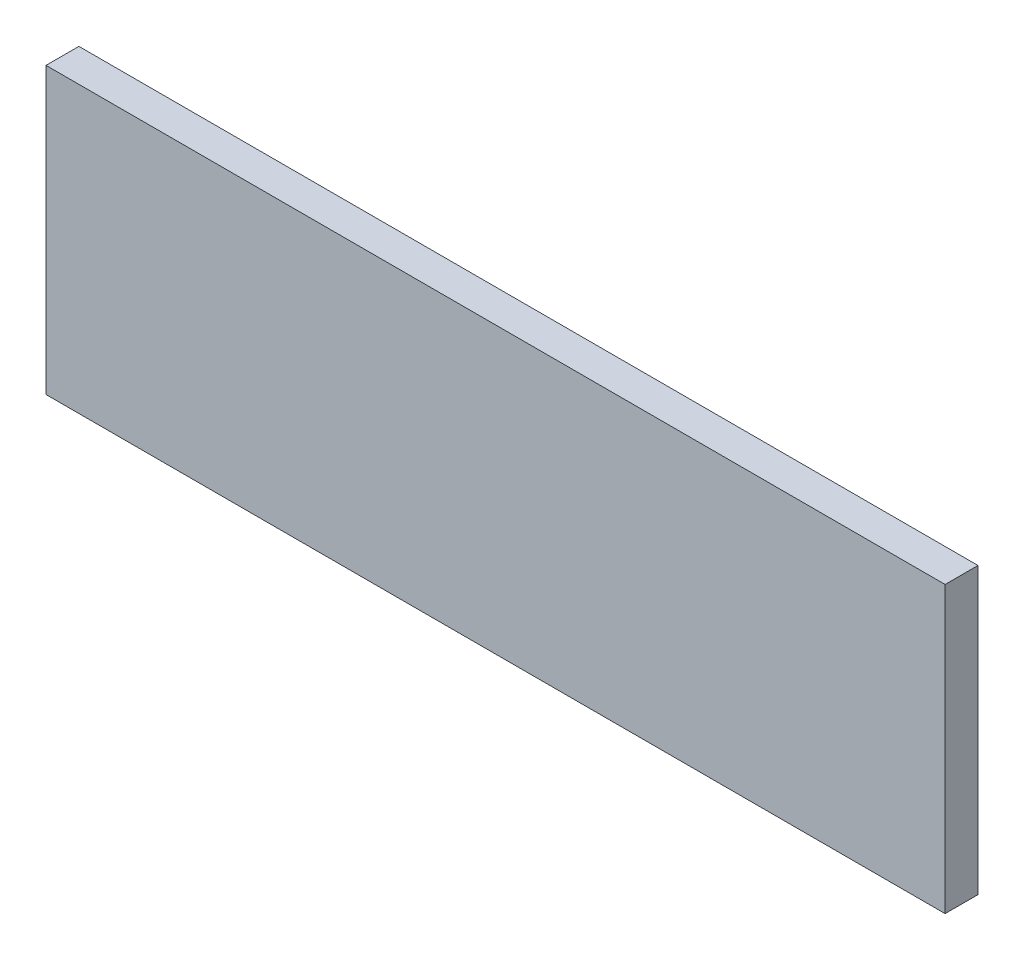
ISO-10303-21;
HEADER;
FILE_DESCRIPTION(('STEP AP214'),'2;1');
FILE_NAME('part.step','',(''),(''),'','','');
FILE_SCHEMA(('AUTOMOTIVE_DESIGN { 1 0 10303 214 1 1 1 1 }'));
ENDSEC;
DATA;
#1=APPLICATION_CONTEXT('core data for automotive mechanical design processes');
#2=APPLICATION_PROTOCOL_DEFINITION('international standard','automotive_design',2000,#1);
#3=PRODUCT_CONTEXT('',#1,'mechanical');
#4=PRODUCT('Part','Part','',(#3));
#5=PRODUCT_RELATED_PRODUCT_CATEGORY('part','',(#4));
#6=PRODUCT_DEFINITION_FORMATION('','',#4);
#7=PRODUCT_DEFINITION_CONTEXT('part definition',#1,'design');
#8=PRODUCT_DEFINITION('design','',#6,#7);
#9=PRODUCT_DEFINITION_SHAPE('','',#8);
#10=(LENGTH_UNIT() NAMED_UNIT(*) SI_UNIT(.MILLI.,.METRE.));
#11=(NAMED_UNIT(*) PLANE_ANGLE_UNIT() SI_UNIT($,.RADIAN.));
#12=(NAMED_UNIT(*) SI_UNIT($,.STERADIAN.) SOLID_ANGLE_UNIT());
#13=UNCERTAINTY_MEASURE_WITH_UNIT(LENGTH_MEASURE(1.E-05),#10,'distance_accuracy_value','');
#14=(GEOMETRIC_REPRESENTATION_CONTEXT(3) GLOBAL_UNCERTAINTY_ASSIGNED_CONTEXT((#13)) GLOBAL_UNIT_ASSIGNED_CONTEXT((#10,
#11,#12)) REPRESENTATION_CONTEXT('',''));
#15=CARTESIAN_POINT('',(0.,0.,0.));
#16=DIRECTION('',(0.,0.,1.));
#17=DIRECTION('',(1.,0.,0.));
#18=AXIS2_PLACEMENT_3D('',#15,#16,#17);
#19=CARTESIAN_POINT('',(0.,26.,3.));
#20=DIRECTION('',(1.,0.,0.));
#21=DIRECTION('',(0.,0.,-1.));
#22=AXIS2_PLACEMENT_3D('',#19,#20,#21);
#23=PLANE('',#22);
#24=DIRECTION('',(0.,-1.,0.));
#25=VECTOR('',#24,1.);
#26=CARTESIAN_POINT('',(0.,26.,0.));
#27=LINE('',#26,#25);
#28=CARTESIAN_POINT('',(0.,26.,0.));
#29=VERTEX_POINT('',#28);
#30=CARTESIAN_POINT('',(0.,0.,0.));
#31=VERTEX_POINT('',#30);
#32=EDGE_CURVE('E102',#29,#31,#27,.T.);
#33=ORIENTED_EDGE('',*,*,#32,.T.);
#34=DIRECTION('',(0.,0.,-1.));
#35=VECTOR('',#34,1.);
#36=CARTESIAN_POINT('',(0.,0.,3.));
#37=LINE('',#36,#35);
#38=CARTESIAN_POINT('',(0.,0.,3.));
#39=VERTEX_POINT('',#38);
#40=EDGE_CURVE('E11',#39,#31,#37,.T.);
#41=ORIENTED_EDGE('',*,*,#40,.F.);
#42=DIRECTION('',(0.,-1.,0.));
#43=VECTOR('',#42,1.);
#44=CARTESIAN_POINT('',(0.,26.,3.));
#45=LINE('',#44,#43);
#46=CARTESIAN_POINT('',(0.,26.,3.));
#47=VERTEX_POINT('',#46);
#48=EDGE_CURVE('E90',#47,#39,#45,.T.);
#49=ORIENTED_EDGE('',*,*,#48,.F.);
#50=DIRECTION('',(0.,0.,-1.));
#51=VECTOR('',#50,1.);
#52=CARTESIAN_POINT('',(0.,26.,3.));
#53=LINE('',#52,#51);
#54=EDGE_CURVE('E98',#47,#29,#53,.T.);
#55=ORIENTED_EDGE('',*,*,#54,.T.);
#56=EDGE_LOOP('',(#33,#41,#49,#55));
#57=FACE_BOUND('',#56,.T.);
#58=ADVANCED_FACE('F39',(#57),#23,.F.);
#59=CARTESIAN_POINT('',(0.,0.,3.));
#60=DIRECTION('',(0.,1.,0.));
#61=DIRECTION('',(0.,0.,1.));
#62=AXIS2_PLACEMENT_3D('',#59,#60,#61);
#63=PLANE('',#62);
#64=DIRECTION('',(1.,0.,0.));
#65=VECTOR('',#64,1.);
#66=CARTESIAN_POINT('',(0.,0.,0.));
#67=LINE('',#66,#65);
#68=CARTESIAN_POINT('',(82.,0.,0.));
#69=VERTEX_POINT('',#68);
#70=EDGE_CURVE('E94',#31,#69,#67,.T.);
#71=ORIENTED_EDGE('',*,*,#70,.T.);
#72=DIRECTION('',(0.,0.,-1.));
#73=VECTOR('',#72,1.);
#74=CARTESIAN_POINT('',(82.,0.,3.));
#75=LINE('',#74,#73);
#76=CARTESIAN_POINT('',(82.,0.,3.));
#77=VERTEX_POINT('',#76);
#78=EDGE_CURVE('E47',#77,#69,#75,.T.);
#79=ORIENTED_EDGE('',*,*,#78,.F.);
#80=DIRECTION('',(1.,0.,0.));
#81=VECTOR('',#80,1.);
#82=CARTESIAN_POINT('',(0.,0.,3.));
#83=LINE('',#82,#81);
#84=EDGE_CURVE('E85',#39,#77,#83,.T.);
#85=ORIENTED_EDGE('',*,*,#84,.F.);
#86=ORIENTED_EDGE('',*,*,#40,.T.);
#87=EDGE_LOOP('',(#71,#79,#85,#86));
#88=FACE_BOUND('',#87,.T.);
#89=ADVANCED_FACE('F93',(#88),#63,.F.);
#90=CARTESIAN_POINT('',(82.,0.,3.));
#91=DIRECTION('',(-1.,0.,0.));
#92=DIRECTION('',(0.,0.,1.));
#93=AXIS2_PLACEMENT_3D('',#90,#91,#92);
#94=PLANE('',#93);
#95=DIRECTION('',(0.,1.,0.));
#96=VECTOR('',#95,1.);
#97=CARTESIAN_POINT('',(82.,0.,0.));
#98=LINE('',#97,#96);
#99=CARTESIAN_POINT('',(82.,26.,0.));
#100=VERTEX_POINT('',#99);
#101=EDGE_CURVE('E72',#69,#100,#98,.T.);
#102=ORIENTED_EDGE('',*,*,#101,.T.);
#103=DIRECTION('',(0.,0.,-1.));
#104=VECTOR('',#103,1.);
#105=CARTESIAN_POINT('',(82.,26.,3.));
#106=LINE('',#105,#104);
#107=CARTESIAN_POINT('',(82.,26.,3.));
#108=VERTEX_POINT('',#107);
#109=EDGE_CURVE('E95',#108,#100,#106,.T.);
#110=ORIENTED_EDGE('',*,*,#109,.F.);
#111=DIRECTION('',(0.,1.,0.));
#112=VECTOR('',#111,1.);
#113=CARTESIAN_POINT('',(82.,0.,3.));
#114=LINE('',#113,#112);
#115=EDGE_CURVE('E88',#77,#108,#114,.T.);
#116=ORIENTED_EDGE('',*,*,#115,.F.);
#117=ORIENTED_EDGE('',*,*,#78,.T.);
#118=EDGE_LOOP('',(#102,#110,#116,#117));
#119=FACE_BOUND('',#118,.T.);
#120=ADVANCED_FACE('F96',(#119),#94,.F.);
#121=CARTESIAN_POINT('',(82.,26.,3.));
#122=DIRECTION('',(0.,-1.,0.));
#123=DIRECTION('',(0.,0.,-1.));
#124=AXIS2_PLACEMENT_3D('',#121,#122,#123);
#125=PLANE('',#124);
#126=DIRECTION('',(-1.,0.,0.));
#127=VECTOR('',#126,1.);
#128=CARTESIAN_POINT('',(82.,26.,0.));
#129=LINE('',#128,#127);
#130=EDGE_CURVE('E78',#100,#29,#129,.T.);
#131=ORIENTED_EDGE('',*,*,#130,.T.);
#132=ORIENTED_EDGE('',*,*,#54,.F.);
#133=DIRECTION('',(-1.,0.,0.));
#134=VECTOR('',#133,1.);
#135=CARTESIAN_POINT('',(82.,26.,3.));
#136=LINE('',#135,#134);
#137=EDGE_CURVE('E55',#108,#47,#136,.T.);
#138=ORIENTED_EDGE('',*,*,#137,.F.);
#139=ORIENTED_EDGE('',*,*,#109,.T.);
#140=EDGE_LOOP('',(#131,#132,#138,#139));
#141=FACE_BOUND('',#140,.T.);
#142=ADVANCED_FACE('F109',(#141),#125,.F.);
#143=CARTESIAN_POINT('',(0.,0.,3.));
#144=DIRECTION('',(0.,0.,1.));
#145=DIRECTION('',(1.,0.,0.));
#146=AXIS2_PLACEMENT_3D('',#143,#144,#145);
#147=PLANE('',#146);
#148=ORIENTED_EDGE('',*,*,#48,.T.);
#149=ORIENTED_EDGE('',*,*,#84,.T.);
#150=ORIENTED_EDGE('',*,*,#115,.T.);
#151=ORIENTED_EDGE('',*,*,#137,.T.);
#152=EDGE_LOOP('',(#148,#149,#150,#151));
#153=FACE_BOUND('',#152,.T.);
#154=ADVANCED_FACE('F86',(#153),#147,.T.);
#155=CARTESIAN_POINT('',(0.,0.,0.));
#156=DIRECTION('',(0.,0.,1.));
#157=DIRECTION('',(1.,0.,0.));
#158=AXIS2_PLACEMENT_3D('',#155,#156,#157);
#159=PLANE('',#158);
#160=ORIENTED_EDGE('',*,*,#32,.F.);
#161=ORIENTED_EDGE('',*,*,#130,.F.);
#162=ORIENTED_EDGE('',*,*,#101,.F.);
#163=ORIENTED_EDGE('',*,*,#70,.F.);
#164=EDGE_LOOP('',(#160,#161,#162,#163));
#165=FACE_BOUND('',#164,.T.);
#166=ADVANCED_FACE('F112',(#165),#159,.F.);
#167=CLOSED_SHELL('',(#58,#89,#120,#142,#154,#166));
#168=MANIFOLD_SOLID_BREP('B2',#167);
#169=ADVANCED_BREP_SHAPE_REPRESENTATION('',(#18,#168),#14);
#170=SHAPE_DEFINITION_REPRESENTATION(#9,#169);
ENDSEC;
END-ISO-10303-21;
